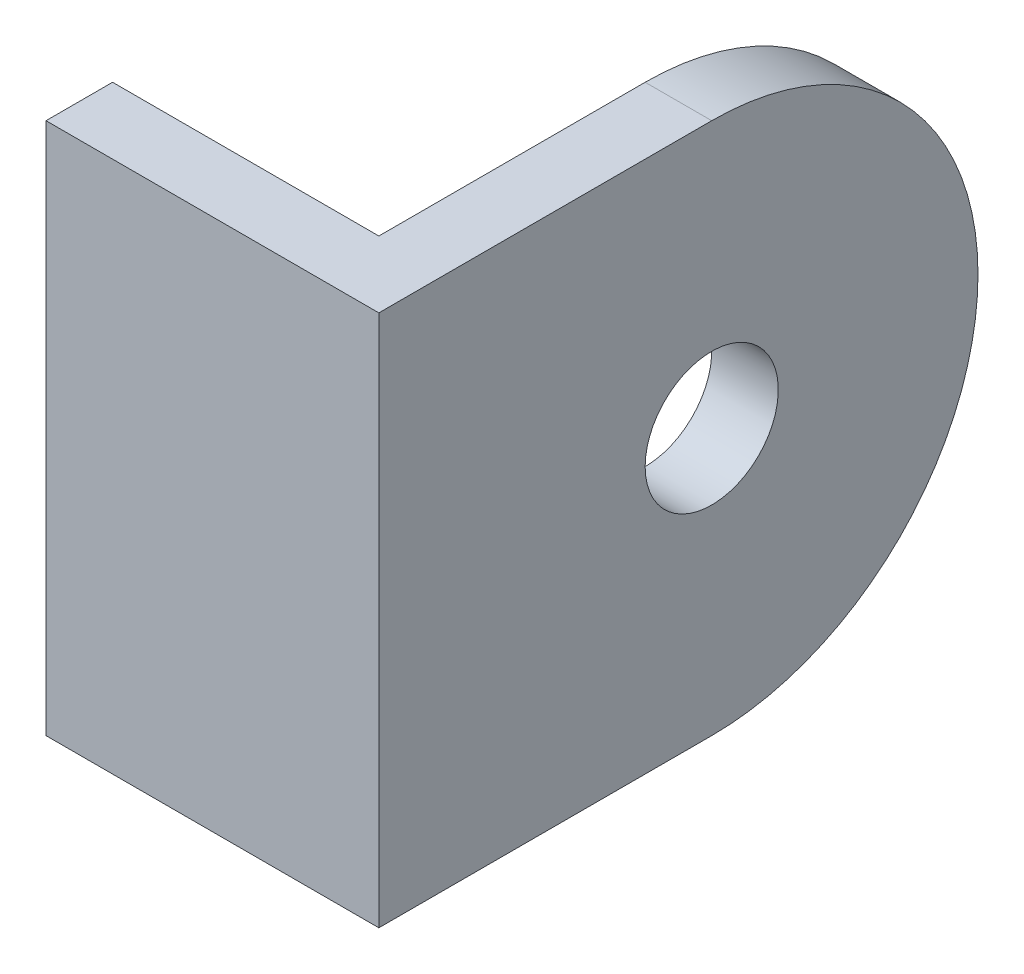
ISO-10303-21;
HEADER;
FILE_DESCRIPTION(('STEP AP214'),'2;1');
FILE_NAME('part.step','',(''),(''),'','','');
FILE_SCHEMA(('AUTOMOTIVE_DESIGN { 1 0 10303 214 1 1 1 1 }'));
ENDSEC;
DATA;
#1=APPLICATION_CONTEXT('core data for automotive mechanical design processes');
#2=APPLICATION_PROTOCOL_DEFINITION('international standard','automotive_design',2000,#1);
#3=PRODUCT_CONTEXT('',#1,'mechanical');
#4=PRODUCT('Part','Part','',(#3));
#5=PRODUCT_RELATED_PRODUCT_CATEGORY('part','',(#4));
#6=PRODUCT_DEFINITION_FORMATION('','',#4);
#7=PRODUCT_DEFINITION_CONTEXT('part definition',#1,'design');
#8=PRODUCT_DEFINITION('design','',#6,#7);
#9=PRODUCT_DEFINITION_SHAPE('','',#8);
#10=(LENGTH_UNIT() NAMED_UNIT(*) SI_UNIT(.MILLI.,.METRE.));
#11=(NAMED_UNIT(*) PLANE_ANGLE_UNIT() SI_UNIT($,.RADIAN.));
#12=(NAMED_UNIT(*) SI_UNIT($,.STERADIAN.) SOLID_ANGLE_UNIT());
#13=UNCERTAINTY_MEASURE_WITH_UNIT(LENGTH_MEASURE(1.E-05),#10,'distance_accuracy_value','');
#14=(GEOMETRIC_REPRESENTATION_CONTEXT(3) GLOBAL_UNCERTAINTY_ASSIGNED_CONTEXT((#13)) GLOBAL_UNIT_ASSIGNED_CONTEXT((#10,
#11,#12)) REPRESENTATION_CONTEXT('',''));
#15=CARTESIAN_POINT('',(0.,0.,0.));
#16=DIRECTION('',(0.,0.,1.));
#17=DIRECTION('',(1.,0.,0.));
#18=AXIS2_PLACEMENT_3D('',#15,#16,#17);
#19=CARTESIAN_POINT('',(-4.41812010102743,20.,24.7985127226701));
#20=DIRECTION('',(1.,0.,0.));
#21=DIRECTION('',(0.,0.,-1.));
#22=AXIS2_PLACEMENT_3D('',#19,#20,#21);
#23=PLANE('',#22);
#24=CARTESIAN_POINT('',(-4.41812010102743,0.,4.79851272267009));
#25=DIRECTION('',(-1.,0.,0.));
#26=DIRECTION('',(0.,0.,1.));
#27=AXIS2_PLACEMENT_3D('',#24,#25,#26);
#28=CIRCLE('',#27,5.);
#29=CARTESIAN_POINT('',(-4.41812010102743,0.,9.79851272267009));
#30=VERTEX_POINT('',#29);
#31=EDGE_CURVE('E251',#30,#30,#28,.T.);
#32=ORIENTED_EDGE('',*,*,#31,.F.);
#33=EDGE_LOOP('',(#32));
#34=FACE_BOUND('',#33,.T.);
#35=DIRECTION('',(0.,0.,1.));
#36=VECTOR('',#35,1.);
#37=CARTESIAN_POINT('',(-4.41812010102743,20.,24.7985127226701));
#38=LINE('',#37,#36);
#39=CARTESIAN_POINT('',(-4.41812010102743,20.,4.79851272267009));
#40=VERTEX_POINT('',#39);
#41=CARTESIAN_POINT('',(-4.41812010102743,20.,24.7985127226701));
#42=VERTEX_POINT('',#41);
#43=EDGE_CURVE('E98',#40,#42,#38,.T.);
#44=ORIENTED_EDGE('',*,*,#43,.F.);
#45=CARTESIAN_POINT('',(-4.41812010102743,0.,4.79851272267009));
#46=DIRECTION('',(1.,0.,0.));
#47=DIRECTION('',(0.,0.,-1.));
#48=AXIS2_PLACEMENT_3D('',#45,#46,#47);
#49=CIRCLE('',#48,20.);
#50=CARTESIAN_POINT('',(-4.41812010102743,0.,-15.2014872773299));
#51=VERTEX_POINT('',#50);
#52=EDGE_CURVE('E49',#40,#51,#49,.F.);
#53=ORIENTED_EDGE('',*,*,#52,.T.);
#54=CARTESIAN_POINT('',(-4.41812010102743,0.,4.79851272267009));
#55=DIRECTION('',(1.,0.,0.));
#56=DIRECTION('',(0.,0.,-1.));
#57=AXIS2_PLACEMENT_3D('',#54,#55,#56);
#58=CIRCLE('',#57,20.);
#59=CARTESIAN_POINT('',(-4.41812010102743,-20.,4.79851272267009));
#60=VERTEX_POINT('',#59);
#61=EDGE_CURVE('E127',#51,#60,#58,.F.);
#62=ORIENTED_EDGE('',*,*,#61,.T.);
#63=DIRECTION('',(0.,0.,1.));
#64=VECTOR('',#63,1.);
#65=CARTESIAN_POINT('',(-4.41812010102743,-20.,24.7985127226701));
#66=LINE('',#65,#64);
#67=CARTESIAN_POINT('',(-4.41812010102743,-20.,24.7985127226701));
#68=VERTEX_POINT('',#67);
#69=EDGE_CURVE('E120',#60,#68,#66,.T.);
#70=ORIENTED_EDGE('',*,*,#69,.T.);
#71=DIRECTION('',(0.,-1.,0.));
#72=VECTOR('',#71,1.);
#73=CARTESIAN_POINT('',(-4.41812010102743,20.,24.7985127226701));
#74=LINE('',#73,#72);
#75=EDGE_CURVE('E112',#42,#68,#74,.T.);
#76=ORIENTED_EDGE('',*,*,#75,.F.);
#77=EDGE_LOOP('',(#44,#53,#62,#70,#76));
#78=FACE_BOUND('',#77,.T.);
#79=ADVANCED_FACE('F39',(#34,#78),#23,.F.);
#80=CARTESIAN_POINT('',(-24.4181201010274,20.,24.7985127226701));
#81=DIRECTION('',(0.,0.,1.));
#82=DIRECTION('',(1.,0.,0.));
#83=AXIS2_PLACEMENT_3D('',#80,#81,#82);
#84=PLANE('',#83);
#85=DIRECTION('',(-1.,0.,0.));
#86=VECTOR('',#85,1.);
#87=CARTESIAN_POINT('',(-24.4181201010274,-20.,24.7985127226701));
#88=LINE('',#87,#86);
#89=CARTESIAN_POINT('',(-24.4181201010274,-20.,24.7985127226701));
#90=VERTEX_POINT('',#89);
#91=EDGE_CURVE('E243',#68,#90,#88,.T.);
#92=ORIENTED_EDGE('',*,*,#91,.T.);
#93=DIRECTION('',(0.,-1.,0.));
#94=VECTOR('',#93,1.);
#95=CARTESIAN_POINT('',(-24.4181201010274,20.,24.7985127226701));
#96=LINE('',#95,#94);
#97=CARTESIAN_POINT('',(-24.4181201010274,20.,24.7985127226701));
#98=VERTEX_POINT('',#97);
#99=EDGE_CURVE('E114',#98,#90,#96,.T.);
#100=ORIENTED_EDGE('',*,*,#99,.F.);
#101=DIRECTION('',(-1.,0.,0.));
#102=VECTOR('',#101,1.);
#103=CARTESIAN_POINT('',(-24.4181201010274,20.,24.7985127226701));
#104=LINE('',#103,#102);
#105=EDGE_CURVE('E101',#42,#98,#104,.T.);
#106=ORIENTED_EDGE('',*,*,#105,.F.);
#107=ORIENTED_EDGE('',*,*,#75,.T.);
#108=EDGE_LOOP('',(#92,#100,#106,#107));
#109=FACE_BOUND('',#108,.T.);
#110=ADVANCED_FACE('F111',(#109),#84,.F.);
#111=CARTESIAN_POINT('',(-24.4181201010274,20.,29.7985127226701));
#112=DIRECTION('',(1.,0.,0.));
#113=DIRECTION('',(0.,0.,-1.));
#114=AXIS2_PLACEMENT_3D('',#111,#112,#113);
#115=PLANE('',#114);
#116=DIRECTION('',(0.,0.,1.));
#117=VECTOR('',#116,1.);
#118=CARTESIAN_POINT('',(-24.4181201010274,-20.,29.7985127226701));
#119=LINE('',#118,#117);
#120=CARTESIAN_POINT('',(-24.4181201010274,-20.,29.7985127226701));
#121=VERTEX_POINT('',#120);
#122=EDGE_CURVE('E248',#90,#121,#119,.T.);
#123=ORIENTED_EDGE('',*,*,#122,.T.);
#124=DIRECTION('',(0.,-1.,0.));
#125=VECTOR('',#124,1.);
#126=CARTESIAN_POINT('',(-24.4181201010274,20.,29.7985127226701));
#127=LINE('',#126,#125);
#128=CARTESIAN_POINT('',(-24.4181201010274,20.,29.7985127226701));
#129=VERTEX_POINT('',#128);
#130=EDGE_CURVE('E129',#129,#121,#127,.T.);
#131=ORIENTED_EDGE('',*,*,#130,.F.);
#132=DIRECTION('',(0.,0.,1.));
#133=VECTOR('',#132,1.);
#134=CARTESIAN_POINT('',(-24.4181201010274,20.,29.7985127226701));
#135=LINE('',#134,#133);
#136=EDGE_CURVE('E117',#98,#129,#135,.T.);
#137=ORIENTED_EDGE('',*,*,#136,.F.);
#138=ORIENTED_EDGE('',*,*,#99,.T.);
#139=EDGE_LOOP('',(#123,#131,#137,#138));
#140=FACE_BOUND('',#139,.T.);
#141=ADVANCED_FACE('F165',(#140),#115,.F.);
#142=CARTESIAN_POINT('',(0.581879898972572,20.,29.7985127226701));
#143=DIRECTION('',(0.,0.,-1.));
#144=DIRECTION('',(-1.,0.,0.));
#145=AXIS2_PLACEMENT_3D('',#142,#143,#144);
#146=PLANE('',#145);
#147=DIRECTION('',(1.,0.,0.));
#148=VECTOR('',#147,1.);
#149=CARTESIAN_POINT('',(0.581879898972572,-20.,29.7985127226701));
#150=LINE('',#149,#148);
#151=CARTESIAN_POINT('',(0.581879898972572,-20.,29.7985127226701));
#152=VERTEX_POINT('',#151);
#153=EDGE_CURVE('E258',#121,#152,#150,.T.);
#154=ORIENTED_EDGE('',*,*,#153,.T.);
#155=DIRECTION('',(0.,-1.,0.));
#156=VECTOR('',#155,1.);
#157=CARTESIAN_POINT('',(0.581879898972572,20.,29.7985127226701));
#158=LINE('',#157,#156);
#159=CARTESIAN_POINT('',(0.581879898972572,20.,29.7985127226701));
#160=VERTEX_POINT('',#159);
#161=EDGE_CURVE('E263',#160,#152,#158,.T.);
#162=ORIENTED_EDGE('',*,*,#161,.F.);
#163=DIRECTION('',(1.,0.,0.));
#164=VECTOR('',#163,1.);
#165=CARTESIAN_POINT('',(0.581879898972572,20.,29.7985127226701));
#166=LINE('',#165,#164);
#167=EDGE_CURVE('E272',#129,#160,#166,.T.);
#168=ORIENTED_EDGE('',*,*,#167,.F.);
#169=ORIENTED_EDGE('',*,*,#130,.T.);
#170=EDGE_LOOP('',(#154,#162,#168,#169));
#171=FACE_BOUND('',#170,.T.);
#172=ADVANCED_FACE('F171',(#171),#146,.F.);
#173=CARTESIAN_POINT('',(0.581879898972567,20.,-15.2014872773299));
#174=DIRECTION('',(-1.,0.,0.));
#175=DIRECTION('',(0.,0.,1.));
#176=AXIS2_PLACEMENT_3D('',#173,#174,#175);
#177=PLANE('',#176);
#178=CARTESIAN_POINT('',(0.581879898972564,0.,4.79851272267009));
#179=DIRECTION('',(-1.,0.,0.));
#180=DIRECTION('',(0.,0.,1.));
#181=AXIS2_PLACEMENT_3D('',#178,#179,#180);
#182=CIRCLE('',#181,5.);
#183=CARTESIAN_POINT('',(0.581879898972564,0.,9.79851272267009));
#184=VERTEX_POINT('',#183);
#185=EDGE_CURVE('E43',#184,#184,#182,.T.);
#186=ORIENTED_EDGE('',*,*,#185,.T.);
#187=EDGE_LOOP('',(#186));
#188=FACE_BOUND('',#187,.T.);
#189=CARTESIAN_POINT('',(0.58187989897257,0.,4.79851272267009));
#190=DIRECTION('',(-1.,0.,0.));
#191=DIRECTION('',(0.,0.,1.));
#192=AXIS2_PLACEMENT_3D('',#189,#190,#191);
#193=CIRCLE('',#192,20.);
#194=CARTESIAN_POINT('',(0.581879898972569,-20.,4.79851272267009));
#195=VERTEX_POINT('',#194);
#196=CARTESIAN_POINT('',(0.581879898972567,0.,-15.2014872773299));
#197=VERTEX_POINT('',#196);
#198=EDGE_CURVE('E138',#195,#197,#193,.F.);
#199=ORIENTED_EDGE('',*,*,#198,.T.);
#200=CARTESIAN_POINT('',(0.581879898972569,0.,4.79851272267009));
#201=DIRECTION('',(-1.,0.,0.));
#202=DIRECTION('',(0.,0.,1.));
#203=AXIS2_PLACEMENT_3D('',#200,#201,#202);
#204=CIRCLE('',#203,20.);
#205=CARTESIAN_POINT('',(0.581879898972569,20.,4.79851272267009));
#206=VERTEX_POINT('',#205);
#207=EDGE_CURVE('E11',#197,#206,#204,.F.);
#208=ORIENTED_EDGE('',*,*,#207,.T.);
#209=DIRECTION('',(0.,0.,-1.));
#210=VECTOR('',#209,1.);
#211=CARTESIAN_POINT('',(0.581879898972567,20.,-15.2014872773299));
#212=LINE('',#211,#210);
#213=EDGE_CURVE('E253',#160,#206,#212,.T.);
#214=ORIENTED_EDGE('',*,*,#213,.F.);
#215=ORIENTED_EDGE('',*,*,#161,.T.);
#216=DIRECTION('',(0.,0.,-1.));
#217=VECTOR('',#216,1.);
#218=CARTESIAN_POINT('',(0.581879898972567,-20.,-15.2014872773299));
#219=LINE('',#218,#217);
#220=EDGE_CURVE('E107',#152,#195,#219,.T.);
#221=ORIENTED_EDGE('',*,*,#220,.T.);
#222=EDGE_LOOP('',(#199,#208,#214,#215,#221));
#223=FACE_BOUND('',#222,.T.);
#224=ADVANCED_FACE('F175',(#188,#223),#177,.F.);
#225=CARTESIAN_POINT('',(0.,20.,0.));
#226=DIRECTION('',(0.,-1.,0.));
#227=DIRECTION('',(0.,0.,-1.));
#228=AXIS2_PLACEMENT_3D('',#225,#226,#227);
#229=PLANE('',#228);
#230=ORIENTED_EDGE('',*,*,#213,.T.);
#231=DIRECTION('',(-1.,0.,0.));
#232=VECTOR('',#231,1.);
#233=CARTESIAN_POINT('',(0.,20.,4.79851272267009));
#234=LINE('',#233,#232);
#235=EDGE_CURVE('E103',#206,#40,#234,.T.);
#236=ORIENTED_EDGE('',*,*,#235,.T.);
#237=ORIENTED_EDGE('',*,*,#43,.T.);
#238=ORIENTED_EDGE('',*,*,#105,.T.);
#239=ORIENTED_EDGE('',*,*,#136,.T.);
#240=ORIENTED_EDGE('',*,*,#167,.T.);
#241=EDGE_LOOP('',(#230,#236,#237,#238,#239,#240));
#242=FACE_BOUND('',#241,.T.);
#243=ADVANCED_FACE('F100',(#242),#229,.F.);
#244=CARTESIAN_POINT('',(0.,-20.,0.));
#245=DIRECTION('',(0.,-1.,0.));
#246=DIRECTION('',(0.,0.,-1.));
#247=AXIS2_PLACEMENT_3D('',#244,#245,#246);
#248=PLANE('',#247);
#249=ORIENTED_EDGE('',*,*,#69,.F.);
#250=DIRECTION('',(-1.,0.,0.));
#251=VECTOR('',#250,1.);
#252=CARTESIAN_POINT('',(0.581879898972567,-20.,4.79851272267009));
#253=LINE('',#252,#251);
#254=EDGE_CURVE('E135',#60,#195,#253,.F.);
#255=ORIENTED_EDGE('',*,*,#254,.T.);
#256=ORIENTED_EDGE('',*,*,#220,.F.);
#257=ORIENTED_EDGE('',*,*,#153,.F.);
#258=ORIENTED_EDGE('',*,*,#122,.F.);
#259=ORIENTED_EDGE('',*,*,#91,.F.);
#260=EDGE_LOOP('',(#249,#255,#256,#257,#258,#259));
#261=FACE_BOUND('',#260,.T.);
#262=ADVANCED_FACE('F158',(#261),#248,.T.);
#263=CARTESIAN_POINT('',(-4.41812010102743,0.,4.79851272267009));
#264=DIRECTION('',(1.,0.,0.));
#265=DIRECTION('',(0.,0.,-1.));
#266=AXIS2_PLACEMENT_3D('',#263,#264,#265);
#267=CYLINDRICAL_SURFACE('',#266,20.);
#268=ORIENTED_EDGE('',*,*,#198,.F.);
#269=ORIENTED_EDGE('',*,*,#254,.F.);
#270=ORIENTED_EDGE('',*,*,#61,.F.);
#271=DIRECTION('',(-1.,0.,0.));
#272=VECTOR('',#271,1.);
#273=CARTESIAN_POINT('',(-4.41812010102743,0.,-15.2014872773299));
#274=LINE('',#273,#272);
#275=EDGE_CURVE('E123',#197,#51,#274,.T.);
#276=ORIENTED_EDGE('',*,*,#275,.F.);
#277=EDGE_LOOP('',(#268,#269,#270,#276));
#278=FACE_BOUND('',#277,.T.);
#279=ADVANCED_FACE('F149',(#278),#267,.T.);
#280=CARTESIAN_POINT('',(0.,0.,4.79851272267009));
#281=DIRECTION('',(-1.,0.,0.));
#282=DIRECTION('',(0.,0.,1.));
#283=AXIS2_PLACEMENT_3D('',#280,#281,#282);
#284=CYLINDRICAL_SURFACE('',#283,20.);
#285=ORIENTED_EDGE('',*,*,#207,.F.);
#286=ORIENTED_EDGE('',*,*,#275,.T.);
#287=ORIENTED_EDGE('',*,*,#52,.F.);
#288=ORIENTED_EDGE('',*,*,#235,.F.);
#289=EDGE_LOOP('',(#285,#286,#287,#288));
#290=FACE_BOUND('',#289,.T.);
#291=ADVANCED_FACE('F41',(#290),#284,.T.);
#292=CARTESIAN_POINT('',(35.5818798989726,0.,4.79851272267009));
#293=DIRECTION('',(-1.,0.,0.));
#294=DIRECTION('',(0.,0.,1.));
#295=AXIS2_PLACEMENT_3D('',#292,#293,#294);
#296=CYLINDRICAL_SURFACE('',#295,5.);
#297=ORIENTED_EDGE('',*,*,#31,.T.);
#298=EDGE_LOOP('',(#297));
#299=FACE_BOUND('',#298,.T.);
#300=ORIENTED_EDGE('',*,*,#185,.F.);
#301=EDGE_LOOP('',(#300));
#302=FACE_BOUND('',#301,.T.);
#303=ADVANCED_FACE('F151',(#299,#302),#296,.F.);
#304=CLOSED_SHELL('',(#79,#110,#141,#172,#224,#243,#262,#279,#291,#303));
#305=MANIFOLD_SOLID_BREP('B2',#304);
#306=ADVANCED_BREP_SHAPE_REPRESENTATION('',(#18,#305),#14);
#307=SHAPE_DEFINITION_REPRESENTATION(#9,#306);
ENDSEC;
END-ISO-10303-21;
